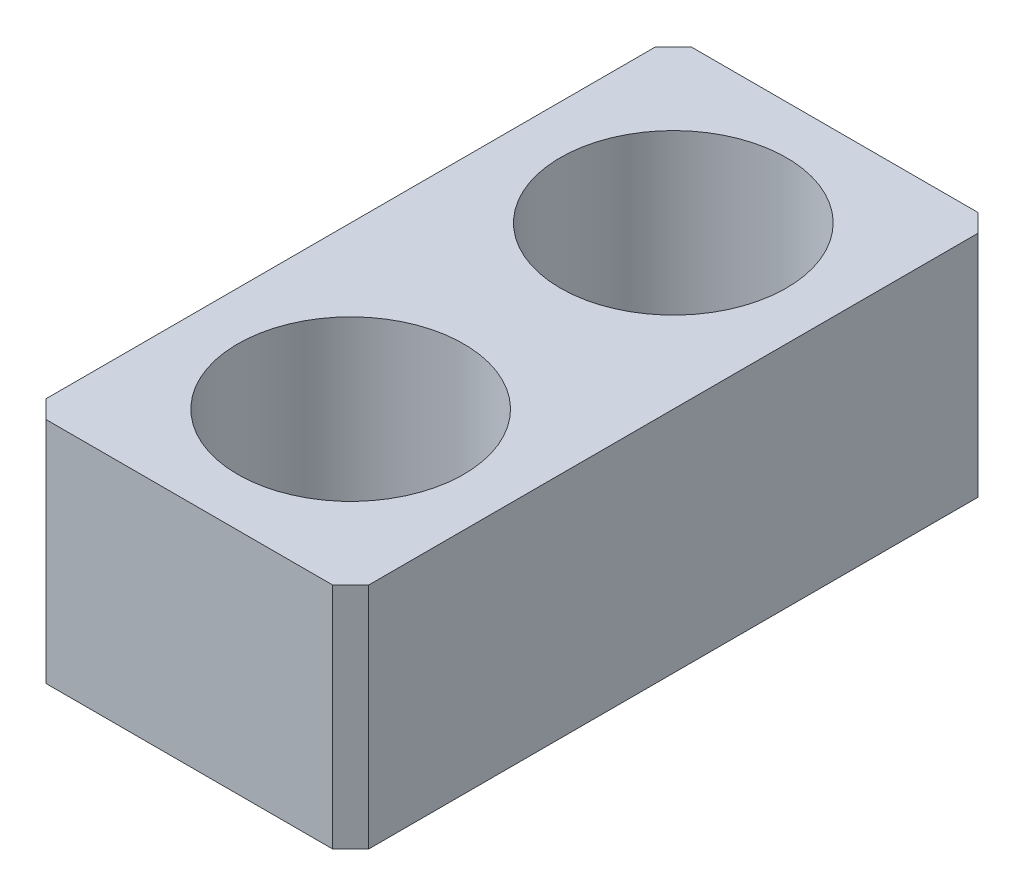
ISO-10303-21;
HEADER;
FILE_DESCRIPTION(('STEP AP214'),'2;1');
FILE_NAME('part.step','',(''),(''),'','','');
FILE_SCHEMA(('AUTOMOTIVE_DESIGN { 1 0 10303 214 1 1 1 1 }'));
ENDSEC;
DATA;
#1=APPLICATION_CONTEXT('core data for automotive mechanical design processes');
#2=APPLICATION_PROTOCOL_DEFINITION('international standard','automotive_design',2000,#1);
#3=PRODUCT_CONTEXT('',#1,'mechanical');
#4=PRODUCT('Part','Part','',(#3));
#5=PRODUCT_RELATED_PRODUCT_CATEGORY('part','',(#4));
#6=PRODUCT_DEFINITION_FORMATION('','',#4);
#7=PRODUCT_DEFINITION_CONTEXT('part definition',#1,'design');
#8=PRODUCT_DEFINITION('design','',#6,#7);
#9=PRODUCT_DEFINITION_SHAPE('','',#8);
#10=(LENGTH_UNIT() NAMED_UNIT(*) SI_UNIT(.MILLI.,.METRE.));
#11=(NAMED_UNIT(*) PLANE_ANGLE_UNIT() SI_UNIT($,.RADIAN.));
#12=(NAMED_UNIT(*) SI_UNIT($,.STERADIAN.) SOLID_ANGLE_UNIT());
#13=UNCERTAINTY_MEASURE_WITH_UNIT(LENGTH_MEASURE(1.E-05),#10,'distance_accuracy_value','');
#14=(GEOMETRIC_REPRESENTATION_CONTEXT(3) GLOBAL_UNCERTAINTY_ASSIGNED_CONTEXT((#13)) GLOBAL_UNIT_ASSIGNED_CONTEXT((#10,
#11,#12)) REPRESENTATION_CONTEXT('',''));
#15=CARTESIAN_POINT('',(0.,0.,0.));
#16=DIRECTION('',(0.,0.,1.));
#17=DIRECTION('',(1.,0.,0.));
#18=AXIS2_PLACEMENT_3D('',#15,#16,#17);
#19=CARTESIAN_POINT('',(1.12857864376269,1.8,-2.54));
#20=DIRECTION('',(-0.707106781186546,0.,0.707106781186549));
#21=DIRECTION('',(0.707106781186549,0.,0.707106781186546));
#22=AXIS2_PLACEMENT_3D('',#19,#20,#21);
#23=PLANE('',#22);
#24=DIRECTION('',(-0.707106781186548,0.,-0.707106781186546));
#25=VECTOR('',#24,1.);
#26=CARTESIAN_POINT('',(1.12857864376269,0.,-2.54));
#27=LINE('',#26,#25);
#28=CARTESIAN_POINT('',(1.27,0.,-2.39857864376269));
#29=VERTEX_POINT('',#28);
#30=CARTESIAN_POINT('',(1.12857864376269,0.,-2.54));
#31=VERTEX_POINT('',#30);
#32=EDGE_CURVE('E130',#29,#31,#27,.T.);
#33=ORIENTED_EDGE('',*,*,#32,.T.);
#34=DIRECTION('',(0.,-1.,0.));
#35=VECTOR('',#34,1.);
#36=CARTESIAN_POINT('',(1.12857864376269,1.8,-2.54));
#37=LINE('',#36,#35);
#38=CARTESIAN_POINT('',(1.12857864376269,1.8,-2.54));
#39=VERTEX_POINT('',#38);
#40=EDGE_CURVE('E11',#39,#31,#37,.T.);
#41=ORIENTED_EDGE('',*,*,#40,.F.);
#42=DIRECTION('',(-0.707106781186548,0.,-0.707106781186546));
#43=VECTOR('',#42,1.);
#44=CARTESIAN_POINT('',(1.12857864376269,1.8,-2.54));
#45=LINE('',#44,#43);
#46=CARTESIAN_POINT('',(1.27,1.8,-2.39857864376269));
#47=VERTEX_POINT('',#46);
#48=EDGE_CURVE('E145',#47,#39,#45,.T.);
#49=ORIENTED_EDGE('',*,*,#48,.F.);
#50=DIRECTION('',(0.,-1.,0.));
#51=VECTOR('',#50,1.);
#52=CARTESIAN_POINT('',(1.27,1.8,-2.39857864376269));
#53=LINE('',#52,#51);
#54=EDGE_CURVE('E126',#47,#29,#53,.T.);
#55=ORIENTED_EDGE('',*,*,#54,.T.);
#56=EDGE_LOOP('',(#33,#41,#49,#55));
#57=FACE_BOUND('',#56,.T.);
#58=ADVANCED_FACE('F34',(#57),#23,.F.);
#59=CARTESIAN_POINT('',(-1.12857864376269,1.8,-2.54));
#60=DIRECTION('',(0.,0.,1.));
#61=DIRECTION('',(1.,0.,0.));
#62=AXIS2_PLACEMENT_3D('',#59,#60,#61);
#63=PLANE('',#62);
#64=DIRECTION('',(-1.,0.,0.));
#65=VECTOR('',#64,1.);
#66=CARTESIAN_POINT('',(-1.12857864376269,0.,-2.54));
#67=LINE('',#66,#65);
#68=CARTESIAN_POINT('',(-1.12857864376269,0.,-2.54));
#69=VERTEX_POINT('',#68);
#70=EDGE_CURVE('E133',#31,#69,#67,.T.);
#71=ORIENTED_EDGE('',*,*,#70,.T.);
#72=DIRECTION('',(0.,-1.,0.));
#73=VECTOR('',#72,1.);
#74=CARTESIAN_POINT('',(-1.12857864376269,1.8,-2.54));
#75=LINE('',#74,#73);
#76=CARTESIAN_POINT('',(-1.12857864376269,1.8,-2.54));
#77=VERTEX_POINT('',#76);
#78=EDGE_CURVE('E42',#77,#69,#75,.T.);
#79=ORIENTED_EDGE('',*,*,#78,.F.);
#80=DIRECTION('',(-1.,0.,0.));
#81=VECTOR('',#80,1.);
#82=CARTESIAN_POINT('',(-1.12857864376269,1.8,-2.54));
#83=LINE('',#82,#81);
#84=EDGE_CURVE('E93',#39,#77,#83,.T.);
#85=ORIENTED_EDGE('',*,*,#84,.F.);
#86=ORIENTED_EDGE('',*,*,#40,.T.);
#87=EDGE_LOOP('',(#71,#79,#85,#86));
#88=FACE_BOUND('',#87,.T.);
#89=ADVANCED_FACE('F214',(#88),#63,.F.);
#90=CARTESIAN_POINT('',(-1.12857864376269,1.8,-2.54));
#91=DIRECTION('',(0.707106781186546,0.,0.707106781186549));
#92=DIRECTION('',(0.707106781186549,0.,-0.707106781186546));
#93=AXIS2_PLACEMENT_3D('',#90,#91,#92);
#94=PLANE('',#93);
#95=DIRECTION('',(-0.707106781186548,0.,0.707106781186546));
#96=VECTOR('',#95,1.);
#97=CARTESIAN_POINT('',(-1.12857864376269,0.,-2.54));
#98=LINE('',#97,#96);
#99=CARTESIAN_POINT('',(-1.27,0.,-2.39857864376269));
#100=VERTEX_POINT('',#99);
#101=EDGE_CURVE('E136',#69,#100,#98,.T.);
#102=ORIENTED_EDGE('',*,*,#101,.T.);
#103=DIRECTION('',(0.,-1.,0.));
#104=VECTOR('',#103,1.);
#105=CARTESIAN_POINT('',(-1.27,1.8,-2.39857864376269));
#106=LINE('',#105,#104);
#107=CARTESIAN_POINT('',(-1.27,1.8,-2.39857864376269));
#108=VERTEX_POINT('',#107);
#109=EDGE_CURVE('E152',#108,#100,#106,.T.);
#110=ORIENTED_EDGE('',*,*,#109,.F.);
#111=DIRECTION('',(-0.707106781186548,0.,0.707106781186546));
#112=VECTOR('',#111,1.);
#113=CARTESIAN_POINT('',(-1.12857864376269,1.8,-2.54));
#114=LINE('',#113,#112);
#115=EDGE_CURVE('E160',#77,#108,#114,.T.);
#116=ORIENTED_EDGE('',*,*,#115,.F.);
#117=ORIENTED_EDGE('',*,*,#78,.T.);
#118=EDGE_LOOP('',(#102,#110,#116,#117));
#119=FACE_BOUND('',#118,.T.);
#120=ADVANCED_FACE('F158',(#119),#94,.F.);
#121=CARTESIAN_POINT('',(-1.27,1.8,-2.39857864376269));
#122=DIRECTION('',(1.,0.,0.));
#123=DIRECTION('',(0.,0.,-1.));
#124=AXIS2_PLACEMENT_3D('',#121,#122,#123);
#125=PLANE('',#124);
#126=DIRECTION('',(0.,0.,1.));
#127=VECTOR('',#126,1.);
#128=CARTESIAN_POINT('',(-1.27,0.,-2.39857864376269));
#129=LINE('',#128,#127);
#130=CARTESIAN_POINT('',(-1.27,0.,2.39857864376269));
#131=VERTEX_POINT('',#130);
#132=EDGE_CURVE('E138',#100,#131,#129,.T.);
#133=ORIENTED_EDGE('',*,*,#132,.T.);
#134=DIRECTION('',(0.,-1.,0.));
#135=VECTOR('',#134,1.);
#136=CARTESIAN_POINT('',(-1.27,1.8,2.39857864376269));
#137=LINE('',#136,#135);
#138=CARTESIAN_POINT('',(-1.27,1.8,2.39857864376269));
#139=VERTEX_POINT('',#138);
#140=EDGE_CURVE('E149',#139,#131,#137,.T.);
#141=ORIENTED_EDGE('',*,*,#140,.F.);
#142=DIRECTION('',(0.,0.,1.));
#143=VECTOR('',#142,1.);
#144=CARTESIAN_POINT('',(-1.27,1.8,-2.39857864376269));
#145=LINE('',#144,#143);
#146=EDGE_CURVE('E172',#108,#139,#145,.T.);
#147=ORIENTED_EDGE('',*,*,#146,.F.);
#148=ORIENTED_EDGE('',*,*,#109,.T.);
#149=EDGE_LOOP('',(#133,#141,#147,#148));
#150=FACE_BOUND('',#149,.T.);
#151=ADVANCED_FACE('F168',(#150),#125,.F.);
#152=CARTESIAN_POINT('',(-1.12857864376269,1.8,2.54));
#153=DIRECTION('',(0.707106781186546,0.,-0.707106781186549));
#154=DIRECTION('',(-0.707106781186549,0.,-0.707106781186546));
#155=AXIS2_PLACEMENT_3D('',#152,#153,#154);
#156=PLANE('',#155);
#157=DIRECTION('',(0.707106781186548,0.,0.707106781186546));
#158=VECTOR('',#157,1.);
#159=CARTESIAN_POINT('',(-1.12857864376269,0.,2.54));
#160=LINE('',#159,#158);
#161=CARTESIAN_POINT('',(-1.12857864376269,0.,2.54));
#162=VERTEX_POINT('',#161);
#163=EDGE_CURVE('E140',#131,#162,#160,.T.);
#164=ORIENTED_EDGE('',*,*,#163,.T.);
#165=DIRECTION('',(0.,-1.,0.));
#166=VECTOR('',#165,1.);
#167=CARTESIAN_POINT('',(-1.12857864376269,1.8,2.54));
#168=LINE('',#167,#166);
#169=CARTESIAN_POINT('',(-1.12857864376269,1.8,2.54));
#170=VERTEX_POINT('',#169);
#171=EDGE_CURVE('E121',#170,#162,#168,.T.);
#172=ORIENTED_EDGE('',*,*,#171,.F.);
#173=DIRECTION('',(0.707106781186548,0.,0.707106781186546));
#174=VECTOR('',#173,1.);
#175=CARTESIAN_POINT('',(-1.12857864376269,1.8,2.54));
#176=LINE('',#175,#174);
#177=EDGE_CURVE('E112',#139,#170,#176,.T.);
#178=ORIENTED_EDGE('',*,*,#177,.F.);
#179=ORIENTED_EDGE('',*,*,#140,.T.);
#180=EDGE_LOOP('',(#164,#172,#178,#179));
#181=FACE_BOUND('',#180,.T.);
#182=ADVANCED_FACE('F171',(#181),#156,.F.);
#183=CARTESIAN_POINT('',(-1.12857864376269,1.8,2.54));
#184=DIRECTION('',(0.,0.,-1.));
#185=DIRECTION('',(-1.,0.,0.));
#186=AXIS2_PLACEMENT_3D('',#183,#184,#185);
#187=PLANE('',#186);
#188=DIRECTION('',(1.,0.,0.));
#189=VECTOR('',#188,1.);
#190=CARTESIAN_POINT('',(-1.12857864376269,0.,2.54));
#191=LINE('',#190,#189);
#192=CARTESIAN_POINT('',(1.12857864376269,0.,2.54));
#193=VERTEX_POINT('',#192);
#194=EDGE_CURVE('E120',#162,#193,#191,.T.);
#195=ORIENTED_EDGE('',*,*,#194,.T.);
#196=DIRECTION('',(0.,-1.,0.));
#197=VECTOR('',#196,1.);
#198=CARTESIAN_POINT('',(1.12857864376269,1.8,2.54));
#199=LINE('',#198,#197);
#200=CARTESIAN_POINT('',(1.12857864376269,1.8,2.54));
#201=VERTEX_POINT('',#200);
#202=EDGE_CURVE('E117',#201,#193,#199,.T.);
#203=ORIENTED_EDGE('',*,*,#202,.F.);
#204=DIRECTION('',(1.,0.,0.));
#205=VECTOR('',#204,1.);
#206=CARTESIAN_POINT('',(-1.12857864376269,1.8,2.54));
#207=LINE('',#206,#205);
#208=EDGE_CURVE('E106',#170,#201,#207,.T.);
#209=ORIENTED_EDGE('',*,*,#208,.F.);
#210=ORIENTED_EDGE('',*,*,#171,.T.);
#211=EDGE_LOOP('',(#195,#203,#209,#210));
#212=FACE_BOUND('',#211,.T.);
#213=ADVANCED_FACE('F118',(#212),#187,.F.);
#214=CARTESIAN_POINT('',(1.12857864376269,1.8,2.54));
#215=DIRECTION('',(-0.707106781186546,0.,-0.707106781186549));
#216=DIRECTION('',(-0.707106781186549,0.,0.707106781186546));
#217=AXIS2_PLACEMENT_3D('',#214,#215,#216);
#218=PLANE('',#217);
#219=DIRECTION('',(0.707106781186548,0.,-0.707106781186546));
#220=VECTOR('',#219,1.);
#221=CARTESIAN_POINT('',(1.12857864376269,0.,2.54));
#222=LINE('',#221,#220);
#223=CARTESIAN_POINT('',(1.27,0.,2.39857864376269));
#224=VERTEX_POINT('',#223);
#225=EDGE_CURVE('E79',#193,#224,#222,.T.);
#226=ORIENTED_EDGE('',*,*,#225,.T.);
#227=DIRECTION('',(0.,-1.,0.));
#228=VECTOR('',#227,1.);
#229=CARTESIAN_POINT('',(1.27,1.8,2.39857864376269));
#230=LINE('',#229,#228);
#231=CARTESIAN_POINT('',(1.27,1.8,2.39857864376269));
#232=VERTEX_POINT('',#231);
#233=EDGE_CURVE('E122',#232,#224,#230,.T.);
#234=ORIENTED_EDGE('',*,*,#233,.F.);
#235=DIRECTION('',(0.707106781186548,0.,-0.707106781186546));
#236=VECTOR('',#235,1.);
#237=CARTESIAN_POINT('',(1.12857864376269,1.8,2.54));
#238=LINE('',#237,#236);
#239=EDGE_CURVE('E110',#201,#232,#238,.T.);
#240=ORIENTED_EDGE('',*,*,#239,.F.);
#241=ORIENTED_EDGE('',*,*,#202,.T.);
#242=EDGE_LOOP('',(#226,#234,#240,#241));
#243=FACE_BOUND('',#242,.T.);
#244=ADVANCED_FACE('F124',(#243),#218,.F.);
#245=CARTESIAN_POINT('',(1.27,1.8,-2.39857864376269));
#246=DIRECTION('',(-1.,0.,0.));
#247=DIRECTION('',(0.,0.,1.));
#248=AXIS2_PLACEMENT_3D('',#245,#246,#247);
#249=PLANE('',#248);
#250=DIRECTION('',(0.,0.,-1.));
#251=VECTOR('',#250,1.);
#252=CARTESIAN_POINT('',(1.27,0.,-2.39857864376269));
#253=LINE('',#252,#251);
#254=EDGE_CURVE('E85',#224,#29,#253,.T.);
#255=ORIENTED_EDGE('',*,*,#254,.T.);
#256=ORIENTED_EDGE('',*,*,#54,.F.);
#257=DIRECTION('',(0.,0.,-1.));
#258=VECTOR('',#257,1.);
#259=CARTESIAN_POINT('',(1.27,1.8,-2.39857864376269));
#260=LINE('',#259,#258);
#261=EDGE_CURVE('E50',#232,#47,#260,.T.);
#262=ORIENTED_EDGE('',*,*,#261,.F.);
#263=ORIENTED_EDGE('',*,*,#233,.T.);
#264=EDGE_LOOP('',(#255,#256,#262,#263));
#265=FACE_BOUND('',#264,.T.);
#266=ADVANCED_FACE('F201',(#265),#249,.F.);
#267=CARTESIAN_POINT('',(0.,1.8,0.));
#268=DIRECTION('',(0.,1.,0.));
#269=DIRECTION('',(0.,0.,1.));
#270=AXIS2_PLACEMENT_3D('',#267,#268,#269);
#271=PLANE('',#270);
#272=CARTESIAN_POINT('',(0.,1.8,1.27));
#273=DIRECTION('',(0.,1.,0.));
#274=DIRECTION('',(0.,0.,1.));
#275=AXIS2_PLACEMENT_3D('',#272,#273,#274);
#276=CIRCLE('',#275,0.89);
#277=CARTESIAN_POINT('',(0.,1.8,2.16));
#278=VERTEX_POINT('',#277);
#279=EDGE_CURVE('E184',#278,#278,#276,.T.);
#280=ORIENTED_EDGE('',*,*,#279,.F.);
#281=EDGE_LOOP('',(#280));
#282=FACE_BOUND('',#281,.T.);
#283=CARTESIAN_POINT('',(0.,1.8,-1.27));
#284=DIRECTION('',(0.,1.,0.));
#285=DIRECTION('',(0.,0.,1.));
#286=AXIS2_PLACEMENT_3D('',#283,#284,#285);
#287=CIRCLE('',#286,0.89);
#288=CARTESIAN_POINT('',(0.,1.8,-0.38));
#289=VERTEX_POINT('',#288);
#290=EDGE_CURVE('E178',#289,#289,#287,.T.);
#291=ORIENTED_EDGE('',*,*,#290,.F.);
#292=EDGE_LOOP('',(#291));
#293=FACE_BOUND('',#292,.T.);
#294=ORIENTED_EDGE('',*,*,#48,.T.);
#295=ORIENTED_EDGE('',*,*,#84,.T.);
#296=ORIENTED_EDGE('',*,*,#115,.T.);
#297=ORIENTED_EDGE('',*,*,#146,.T.);
#298=ORIENTED_EDGE('',*,*,#177,.T.);
#299=ORIENTED_EDGE('',*,*,#208,.T.);
#300=ORIENTED_EDGE('',*,*,#239,.T.);
#301=ORIENTED_EDGE('',*,*,#261,.T.);
#302=EDGE_LOOP('',(#294,#295,#296,#297,#298,#299,#300,#301));
#303=FACE_BOUND('',#302,.T.);
#304=ADVANCED_FACE('F108',(#282,#293,#303),#271,.T.);
#305=CARTESIAN_POINT('',(0.,0.,0.));
#306=DIRECTION('',(0.,1.,0.));
#307=DIRECTION('',(0.,0.,1.));
#308=AXIS2_PLACEMENT_3D('',#305,#306,#307);
#309=PLANE('',#308);
#310=CARTESIAN_POINT('',(0.,0.,1.27));
#311=DIRECTION('',(0.,1.,0.));
#312=DIRECTION('',(0.,0.,1.));
#313=AXIS2_PLACEMENT_3D('',#310,#311,#312);
#314=CIRCLE('',#313,0.89);
#315=CARTESIAN_POINT('',(0.,0.,2.16));
#316=VERTEX_POINT('',#315);
#317=EDGE_CURVE('E181',#316,#316,#314,.T.);
#318=ORIENTED_EDGE('',*,*,#317,.T.);
#319=EDGE_LOOP('',(#318));
#320=FACE_BOUND('',#319,.T.);
#321=CARTESIAN_POINT('',(0.,0.,-1.27));
#322=DIRECTION('',(0.,1.,0.));
#323=DIRECTION('',(0.,0.,1.));
#324=AXIS2_PLACEMENT_3D('',#321,#322,#323);
#325=CIRCLE('',#324,0.89);
#326=CARTESIAN_POINT('',(0.,0.,-0.38));
#327=VERTEX_POINT('',#326);
#328=EDGE_CURVE('E134',#327,#327,#325,.T.);
#329=ORIENTED_EDGE('',*,*,#328,.T.);
#330=EDGE_LOOP('',(#329));
#331=FACE_BOUND('',#330,.T.);
#332=ORIENTED_EDGE('',*,*,#32,.F.);
#333=ORIENTED_EDGE('',*,*,#254,.F.);
#334=ORIENTED_EDGE('',*,*,#225,.F.);
#335=ORIENTED_EDGE('',*,*,#194,.F.);
#336=ORIENTED_EDGE('',*,*,#163,.F.);
#337=ORIENTED_EDGE('',*,*,#132,.F.);
#338=ORIENTED_EDGE('',*,*,#101,.F.);
#339=ORIENTED_EDGE('',*,*,#70,.F.);
#340=EDGE_LOOP('',(#332,#333,#334,#335,#336,#337,#338,#339));
#341=FACE_BOUND('',#340,.T.);
#342=ADVANCED_FACE('F164',(#320,#331,#341),#309,.F.);
#343=CARTESIAN_POINT('',(0.,0.,-1.27));
#344=DIRECTION('',(0.,1.,0.));
#345=DIRECTION('',(0.,0.,1.));
#346=AXIS2_PLACEMENT_3D('',#343,#344,#345);
#347=CYLINDRICAL_SURFACE('',#346,0.89);
#348=ORIENTED_EDGE('',*,*,#328,.F.);
#349=EDGE_LOOP('',(#348));
#350=FACE_BOUND('',#349,.T.);
#351=ORIENTED_EDGE('',*,*,#290,.T.);
#352=EDGE_LOOP('',(#351));
#353=FACE_BOUND('',#352,.T.);
#354=ADVANCED_FACE('F195',(#350,#353),#347,.F.);
#355=CARTESIAN_POINT('',(0.,0.,1.27));
#356=DIRECTION('',(0.,1.,0.));
#357=DIRECTION('',(0.,0.,1.));
#358=AXIS2_PLACEMENT_3D('',#355,#356,#357);
#359=CYLINDRICAL_SURFACE('',#358,0.89);
#360=ORIENTED_EDGE('',*,*,#317,.F.);
#361=EDGE_LOOP('',(#360));
#362=FACE_BOUND('',#361,.T.);
#363=ORIENTED_EDGE('',*,*,#279,.T.);
#364=EDGE_LOOP('',(#363));
#365=FACE_BOUND('',#364,.T.);
#366=ADVANCED_FACE('F192',(#362,#365),#359,.F.);
#367=CLOSED_SHELL('',(#58,#89,#120,#151,#182,#213,#244,#266,#304,#342,#354,#366));
#368=MANIFOLD_SOLID_BREP('B2',#367);
#369=ADVANCED_BREP_SHAPE_REPRESENTATION('',(#18,#368),#14);
#370=SHAPE_DEFINITION_REPRESENTATION(#9,#369);
ENDSEC;
END-ISO-10303-21;
